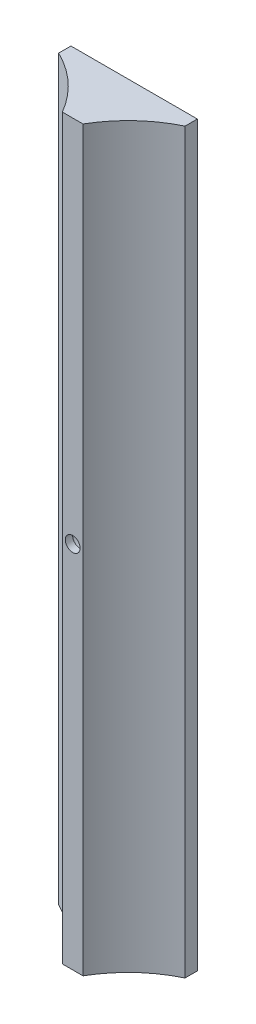
ISO-10303-21;
HEADER;
FILE_DESCRIPTION(('STEP AP214'),'2;1');
FILE_NAME('part.step','',(''),(''),'','','');
FILE_SCHEMA(('AUTOMOTIVE_DESIGN { 1 0 10303 214 1 1 1 1 }'));
ENDSEC;
DATA;
#1=APPLICATION_CONTEXT('core data for automotive mechanical design processes');
#2=APPLICATION_PROTOCOL_DEFINITION('international standard','automotive_design',2000,#1);
#3=PRODUCT_CONTEXT('',#1,'mechanical');
#4=PRODUCT('Part','Part','',(#3));
#5=PRODUCT_RELATED_PRODUCT_CATEGORY('part','',(#4));
#6=PRODUCT_DEFINITION_FORMATION('','',#4);
#7=PRODUCT_DEFINITION_CONTEXT('part definition',#1,'design');
#8=PRODUCT_DEFINITION('design','',#6,#7);
#9=PRODUCT_DEFINITION_SHAPE('','',#8);
#10=(LENGTH_UNIT() NAMED_UNIT(*) SI_UNIT(.MILLI.,.METRE.));
#11=(NAMED_UNIT(*) PLANE_ANGLE_UNIT() SI_UNIT($,.RADIAN.));
#12=(NAMED_UNIT(*) SI_UNIT($,.STERADIAN.) SOLID_ANGLE_UNIT());
#13=UNCERTAINTY_MEASURE_WITH_UNIT(LENGTH_MEASURE(1.E-05),#10,'distance_accuracy_value','');
#14=(GEOMETRIC_REPRESENTATION_CONTEXT(3) GLOBAL_UNCERTAINTY_ASSIGNED_CONTEXT((#13)) GLOBAL_UNIT_ASSIGNED_CONTEXT((#10,
#11,#12)) REPRESENTATION_CONTEXT('',''));
#15=CARTESIAN_POINT('',(0.,0.,0.));
#16=DIRECTION('',(0.,0.,1.));
#17=DIRECTION('',(1.,0.,0.));
#18=AXIS2_PLACEMENT_3D('',#15,#16,#17);
#19=CARTESIAN_POINT('',(-9.5,30.,5.));
#20=DIRECTION('',(0.,-1.,0.));
#21=DIRECTION('',(0.,0.,-1.));
#22=AXIS2_PLACEMENT_3D('',#19,#20,#21);
#23=CYLINDRICAL_SURFACE('',#22,10.);
#24=CARTESIAN_POINT('',(-9.5,-30.,5.));
#25=DIRECTION('',(0.,-1.,0.));
#26=DIRECTION('',(0.,0.,-1.));
#27=AXIS2_PLACEMENT_3D('',#24,#25,#26);
#28=CIRCLE('',#27,10.);
#29=CARTESIAN_POINT('',(-5.14110105645933,-30.,-4.));
#30=VERTEX_POINT('',#29);
#31=CARTESIAN_POINT('',(-0.839745962155612,-30.,0.));
#32=VERTEX_POINT('',#31);
#33=EDGE_CURVE('E123',#30,#32,#28,.T.);
#34=ORIENTED_EDGE('',*,*,#33,.T.);
#35=DIRECTION('',(0.,-1.,0.));
#36=VECTOR('',#35,1.);
#37=CARTESIAN_POINT('',(-0.839745962155612,30.,0.));
#38=LINE('',#37,#36);
#39=CARTESIAN_POINT('',(-0.839745962155612,30.,0.));
#40=VERTEX_POINT('',#39);
#41=EDGE_CURVE('E11',#40,#32,#38,.T.);
#42=ORIENTED_EDGE('',*,*,#41,.F.);
#43=CARTESIAN_POINT('',(-9.5,30.,5.));
#44=DIRECTION('',(0.,-1.,0.));
#45=DIRECTION('',(0.,0.,-1.));
#46=AXIS2_PLACEMENT_3D('',#43,#44,#45);
#47=CIRCLE('',#46,10.);
#48=CARTESIAN_POINT('',(-5.14110105645933,30.,-4.));
#49=VERTEX_POINT('',#48);
#50=EDGE_CURVE('E134',#49,#40,#47,.T.);
#51=ORIENTED_EDGE('',*,*,#50,.F.);
#52=DIRECTION('',(0.,-1.,0.));
#53=VECTOR('',#52,1.);
#54=CARTESIAN_POINT('',(-5.14110105645933,30.,-4.));
#55=LINE('',#54,#53);
#56=EDGE_CURVE('E119',#49,#30,#55,.T.);
#57=ORIENTED_EDGE('',*,*,#56,.T.);
#58=EDGE_LOOP('',(#34,#42,#51,#57));
#59=FACE_BOUND('',#58,.T.);
#60=ADVANCED_FACE('F38',(#59),#23,.F.);
#61=CARTESIAN_POINT('',(-0.839745962155612,30.,0.));
#62=DIRECTION('',(0.,0.,-1.));
#63=DIRECTION('',(-1.,0.,0.));
#64=AXIS2_PLACEMENT_3D('',#61,#62,#63);
#65=PLANE('',#64);
#66=CARTESIAN_POINT('',(0.,0.,0.));
#67=DIRECTION('',(0.,0.,-1.));
#68=DIRECTION('',(-1.,0.,0.));
#69=AXIS2_PLACEMENT_3D('',#66,#67,#68);
#70=CIRCLE('',#69,0.599999999999999);
#71=CARTESIAN_POINT('',(-0.599999999999999,0.,0.));
#72=VERTEX_POINT('',#71);
#73=EDGE_CURVE('E245',#72,#72,#70,.T.);
#74=ORIENTED_EDGE('',*,*,#73,.T.);
#75=EDGE_LOOP('',(#74));
#76=FACE_BOUND('',#75,.T.);
#77=DIRECTION('',(1.,0.,0.));
#78=VECTOR('',#77,1.);
#79=CARTESIAN_POINT('',(-0.839745962155612,-30.,0.));
#80=LINE('',#79,#78);
#81=CARTESIAN_POINT('',(0.839745962155612,-30.,0.));
#82=VERTEX_POINT('',#81);
#83=EDGE_CURVE('E126',#32,#82,#80,.T.);
#84=ORIENTED_EDGE('',*,*,#83,.T.);
#85=DIRECTION('',(0.,-1.,0.));
#86=VECTOR('',#85,1.);
#87=CARTESIAN_POINT('',(0.839745962155612,30.,0.));
#88=LINE('',#87,#86);
#89=CARTESIAN_POINT('',(0.839745962155612,30.,0.));
#90=VERTEX_POINT('',#89);
#91=EDGE_CURVE('E47',#90,#82,#88,.T.);
#92=ORIENTED_EDGE('',*,*,#91,.F.);
#93=DIRECTION('',(1.,0.,0.));
#94=VECTOR('',#93,1.);
#95=CARTESIAN_POINT('',(-0.839745962155612,30.,0.));
#96=LINE('',#95,#94);
#97=EDGE_CURVE('E92',#40,#90,#96,.T.);
#98=ORIENTED_EDGE('',*,*,#97,.F.);
#99=ORIENTED_EDGE('',*,*,#41,.T.);
#100=EDGE_LOOP('',(#84,#92,#98,#99));
#101=FACE_BOUND('',#100,.T.);
#102=ADVANCED_FACE('F160',(#76,#101),#65,.F.);
#103=CARTESIAN_POINT('',(9.5,30.,5.));
#104=DIRECTION('',(0.,-1.,0.));
#105=DIRECTION('',(0.,0.,-1.));
#106=AXIS2_PLACEMENT_3D('',#103,#104,#105);
#107=CYLINDRICAL_SURFACE('',#106,10.);
#108=CARTESIAN_POINT('',(9.5,-30.,5.));
#109=DIRECTION('',(0.,-1.,0.));
#110=DIRECTION('',(0.,0.,-1.));
#111=AXIS2_PLACEMENT_3D('',#108,#109,#110);
#112=CIRCLE('',#111,10.);
#113=CARTESIAN_POINT('',(5.14110105645933,-30.,-4.));
#114=VERTEX_POINT('',#113);
#115=EDGE_CURVE('E129',#82,#114,#112,.T.);
#116=ORIENTED_EDGE('',*,*,#115,.T.);
#117=DIRECTION('',(0.,-1.,0.));
#118=VECTOR('',#117,1.);
#119=CARTESIAN_POINT('',(5.14110105645933,30.,-4.));
#120=LINE('',#119,#118);
#121=CARTESIAN_POINT('',(5.14110105645933,30.,-4.));
#122=VERTEX_POINT('',#121);
#123=EDGE_CURVE('E114',#122,#114,#120,.T.);
#124=ORIENTED_EDGE('',*,*,#123,.F.);
#125=CARTESIAN_POINT('',(9.5,30.,5.));
#126=DIRECTION('',(0.,-1.,0.));
#127=DIRECTION('',(0.,0.,-1.));
#128=AXIS2_PLACEMENT_3D('',#125,#126,#127);
#129=CIRCLE('',#128,10.);
#130=EDGE_CURVE('E105',#90,#122,#129,.T.);
#131=ORIENTED_EDGE('',*,*,#130,.F.);
#132=ORIENTED_EDGE('',*,*,#91,.T.);
#133=EDGE_LOOP('',(#116,#124,#131,#132));
#134=FACE_BOUND('',#133,.T.);
#135=ADVANCED_FACE('F141',(#134),#107,.F.);
#136=CARTESIAN_POINT('',(5.14110105645933,30.,-4.));
#137=DIRECTION('',(-1.,0.,0.));
#138=DIRECTION('',(0.,0.,1.));
#139=AXIS2_PLACEMENT_3D('',#136,#137,#138);
#140=PLANE('',#139);
#141=DIRECTION('',(0.,0.,-1.));
#142=VECTOR('',#141,1.);
#143=CARTESIAN_POINT('',(5.14110105645933,-30.,-4.));
#144=LINE('',#143,#142);
#145=CARTESIAN_POINT('',(5.14110105645933,-30.,-5.));
#146=VERTEX_POINT('',#145);
#147=EDGE_CURVE('E113',#114,#146,#144,.T.);
#148=ORIENTED_EDGE('',*,*,#147,.T.);
#149=DIRECTION('',(0.,-1.,0.));
#150=VECTOR('',#149,1.);
#151=CARTESIAN_POINT('',(5.14110105645933,30.,-5.));
#152=LINE('',#151,#150);
#153=CARTESIAN_POINT('',(5.14110105645933,30.,-5.));
#154=VERTEX_POINT('',#153);
#155=EDGE_CURVE('E110',#154,#146,#152,.T.);
#156=ORIENTED_EDGE('',*,*,#155,.F.);
#157=DIRECTION('',(0.,0.,-1.));
#158=VECTOR('',#157,1.);
#159=CARTESIAN_POINT('',(5.14110105645933,30.,-4.));
#160=LINE('',#159,#158);
#161=EDGE_CURVE('E99',#122,#154,#160,.T.);
#162=ORIENTED_EDGE('',*,*,#161,.F.);
#163=ORIENTED_EDGE('',*,*,#123,.T.);
#164=EDGE_LOOP('',(#148,#156,#162,#163));
#165=FACE_BOUND('',#164,.T.);
#166=ADVANCED_FACE('F111',(#165),#140,.F.);
#167=CARTESIAN_POINT('',(5.14110105645933,30.,-5.));
#168=DIRECTION('',(0.,0.,1.));
#169=DIRECTION('',(1.,0.,0.));
#170=AXIS2_PLACEMENT_3D('',#167,#168,#169);
#171=PLANE('',#170);
#172=CARTESIAN_POINT('',(0.,0.,-5.));
#173=DIRECTION('',(0.,0.,-1.));
#174=DIRECTION('',(-1.,0.,0.));
#175=AXIS2_PLACEMENT_3D('',#172,#173,#174);
#176=CIRCLE('',#175,1.27499999999999);
#177=CARTESIAN_POINT('',(-1.27499999999999,0.,-5.));
#178=VERTEX_POINT('',#177);
#179=EDGE_CURVE('E246',#178,#178,#176,.T.);
#180=ORIENTED_EDGE('',*,*,#179,.F.);
#181=EDGE_LOOP('',(#180));
#182=FACE_BOUND('',#181,.T.);
#183=DIRECTION('',(-1.,0.,0.));
#184=VECTOR('',#183,1.);
#185=CARTESIAN_POINT('',(5.14110105645933,-30.,-5.));
#186=LINE('',#185,#184);
#187=CARTESIAN_POINT('',(-5.14110105645933,-30.,-5.));
#188=VERTEX_POINT('',#187);
#189=EDGE_CURVE('E78',#146,#188,#186,.T.);
#190=ORIENTED_EDGE('',*,*,#189,.T.);
#191=DIRECTION('',(0.,-1.,0.));
#192=VECTOR('',#191,1.);
#193=CARTESIAN_POINT('',(-5.14110105645933,30.,-5.));
#194=LINE('',#193,#192);
#195=CARTESIAN_POINT('',(-5.14110105645933,30.,-5.));
#196=VERTEX_POINT('',#195);
#197=EDGE_CURVE('E115',#196,#188,#194,.T.);
#198=ORIENTED_EDGE('',*,*,#197,.F.);
#199=DIRECTION('',(-1.,0.,0.));
#200=VECTOR('',#199,1.);
#201=CARTESIAN_POINT('',(5.14110105645933,30.,-5.));
#202=LINE('',#201,#200);
#203=EDGE_CURVE('E103',#154,#196,#202,.T.);
#204=ORIENTED_EDGE('',*,*,#203,.F.);
#205=ORIENTED_EDGE('',*,*,#155,.T.);
#206=EDGE_LOOP('',(#190,#198,#204,#205));
#207=FACE_BOUND('',#206,.T.);
#208=ADVANCED_FACE('F117',(#182,#207),#171,.F.);
#209=CARTESIAN_POINT('',(-5.14110105645933,30.,-5.));
#210=DIRECTION('',(1.,0.,0.));
#211=DIRECTION('',(0.,0.,-1.));
#212=AXIS2_PLACEMENT_3D('',#209,#210,#211);
#213=PLANE('',#212);
#214=DIRECTION('',(0.,0.,1.));
#215=VECTOR('',#214,1.);
#216=CARTESIAN_POINT('',(-5.14110105645933,-30.,-5.));
#217=LINE('',#216,#215);
#218=EDGE_CURVE('E84',#188,#30,#217,.T.);
#219=ORIENTED_EDGE('',*,*,#218,.T.);
#220=ORIENTED_EDGE('',*,*,#56,.F.);
#221=DIRECTION('',(0.,0.,1.));
#222=VECTOR('',#221,1.);
#223=CARTESIAN_POINT('',(-5.14110105645933,30.,-5.));
#224=LINE('',#223,#222);
#225=EDGE_CURVE('E55',#196,#49,#224,.T.);
#226=ORIENTED_EDGE('',*,*,#225,.F.);
#227=ORIENTED_EDGE('',*,*,#197,.T.);
#228=EDGE_LOOP('',(#219,#220,#226,#227));
#229=FACE_BOUND('',#228,.T.);
#230=ADVANCED_FACE('F148',(#229),#213,.F.);
#231=CARTESIAN_POINT('',(-9.5,30.,5.));
#232=DIRECTION('',(0.,-1.,0.));
#233=DIRECTION('',(0.,0.,-1.));
#234=AXIS2_PLACEMENT_3D('',#231,#232,#233);
#235=PLANE('',#234);
#236=ORIENTED_EDGE('',*,*,#50,.T.);
#237=ORIENTED_EDGE('',*,*,#97,.T.);
#238=ORIENTED_EDGE('',*,*,#130,.T.);
#239=ORIENTED_EDGE('',*,*,#161,.T.);
#240=ORIENTED_EDGE('',*,*,#203,.T.);
#241=ORIENTED_EDGE('',*,*,#225,.T.);
#242=EDGE_LOOP('',(#236,#237,#238,#239,#240,#241));
#243=FACE_BOUND('',#242,.T.);
#244=ADVANCED_FACE('F101',(#243),#235,.F.);
#245=CARTESIAN_POINT('',(-9.5,-30.,5.));
#246=DIRECTION('',(0.,-1.,0.));
#247=DIRECTION('',(0.,0.,-1.));
#248=AXIS2_PLACEMENT_3D('',#245,#246,#247);
#249=PLANE('',#248);
#250=ORIENTED_EDGE('',*,*,#33,.F.);
#251=ORIENTED_EDGE('',*,*,#218,.F.);
#252=ORIENTED_EDGE('',*,*,#189,.F.);
#253=ORIENTED_EDGE('',*,*,#147,.F.);
#254=ORIENTED_EDGE('',*,*,#115,.F.);
#255=ORIENTED_EDGE('',*,*,#83,.F.);
#256=EDGE_LOOP('',(#250,#251,#252,#253,#254,#255));
#257=FACE_BOUND('',#256,.T.);
#258=ADVANCED_FACE('F144',(#257),#249,.T.);
#259=CARTESIAN_POINT('',(0.,0.,-1.));
#260=DIRECTION('',(0.,0.,-1.));
#261=DIRECTION('',(-1.,0.,0.));
#262=AXIS2_PLACEMENT_3D('',#259,#260,#261);
#263=CONICAL_SURFACE('',#262,1.275,1.02974425867665);
#264=CARTESIAN_POINT('',(0.,0.,-0.594419082156396));
#265=DIRECTION('',(0.,0.,-1.));
#266=DIRECTION('',(-1.,0.,0.));
#267=AXIS2_PLACEMENT_3D('',#264,#265,#266);
#268=CIRCLE('',#267,0.599999999999999);
#269=CARTESIAN_POINT('',(-0.599999999999999,0.,-0.594419082156396));
#270=VERTEX_POINT('',#269);
#271=EDGE_CURVE('E41',#270,#270,#268,.F.);
#272=ORIENTED_EDGE('',*,*,#271,.T.);
#273=EDGE_LOOP('',(#272));
#274=FACE_BOUND('',#273,.T.);
#275=CARTESIAN_POINT('',(0.,0.,-1.));
#276=DIRECTION('',(0.,0.,-1.));
#277=DIRECTION('',(-1.,0.,0.));
#278=AXIS2_PLACEMENT_3D('',#275,#276,#277);
#279=CIRCLE('',#278,1.275);
#280=CARTESIAN_POINT('',(-1.275,0.,-1.));
#281=VERTEX_POINT('',#280);
#282=EDGE_CURVE('E127',#281,#281,#279,.T.);
#283=ORIENTED_EDGE('',*,*,#282,.T.);
#284=EDGE_LOOP('',(#283));
#285=FACE_BOUND('',#284,.T.);
#286=ADVANCED_FACE('F197',(#274,#285),#263,.F.);
#287=CARTESIAN_POINT('',(0.,0.,-5.));
#288=DIRECTION('',(0.,0.,-1.));
#289=DIRECTION('',(-1.,0.,0.));
#290=AXIS2_PLACEMENT_3D('',#287,#288,#289);
#291=CYLINDRICAL_SURFACE('',#290,1.27499999999999);
#292=ORIENTED_EDGE('',*,*,#282,.F.);
#293=EDGE_LOOP('',(#292));
#294=FACE_BOUND('',#293,.T.);
#295=ORIENTED_EDGE('',*,*,#179,.T.);
#296=EDGE_LOOP('',(#295));
#297=FACE_BOUND('',#296,.T.);
#298=ADVANCED_FACE('F191',(#294,#297),#291,.F.);
#299=CARTESIAN_POINT('',(0.,0.,-5.));
#300=DIRECTION('',(0.,0.,-1.));
#301=DIRECTION('',(-1.,0.,0.));
#302=AXIS2_PLACEMENT_3D('',#299,#300,#301);
#303=CYLINDRICAL_SURFACE('',#302,0.599999999999999);
#304=ORIENTED_EDGE('',*,*,#271,.F.);
#305=EDGE_LOOP('',(#304));
#306=FACE_BOUND('',#305,.T.);
#307=ORIENTED_EDGE('',*,*,#73,.F.);
#308=EDGE_LOOP('',(#307));
#309=FACE_BOUND('',#308,.T.);
#310=ADVANCED_FACE('F196',(#306,#309),#303,.F.);
#311=CLOSED_SHELL('',(#60,#102,#135,#166,#208,#230,#244,#258,#286,#298,#310));
#312=MANIFOLD_SOLID_BREP('B2',#311);
#313=ADVANCED_BREP_SHAPE_REPRESENTATION('',(#18,#312),#14);
#314=SHAPE_DEFINITION_REPRESENTATION(#9,#313);
ENDSEC;
END-ISO-10303-21;
